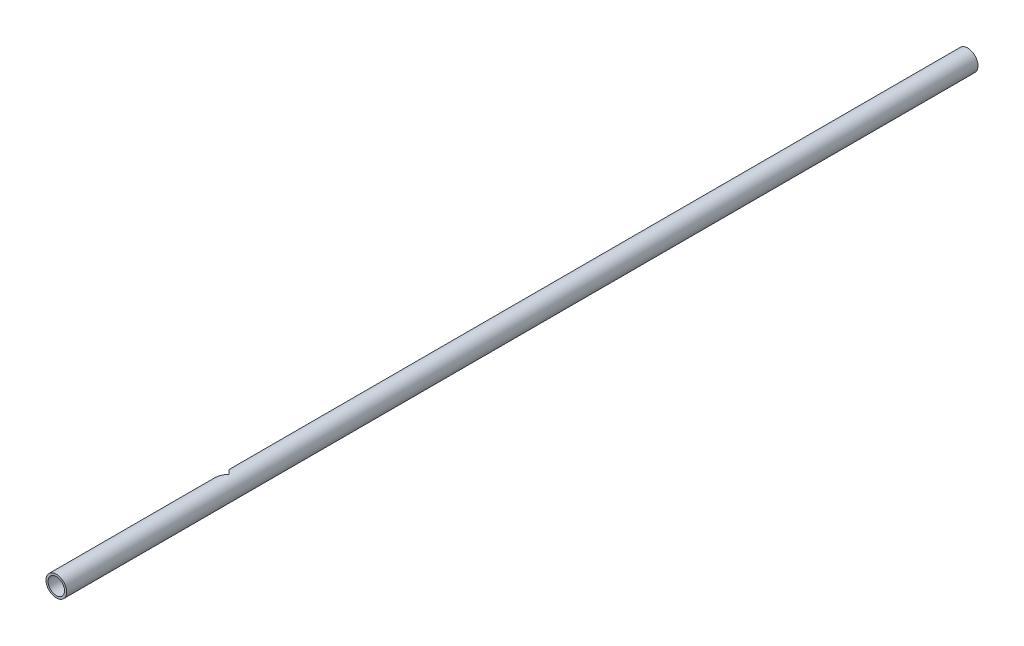
ISO-10303-21;
HEADER;
FILE_DESCRIPTION(('STEP AP214'),'2;1');
FILE_NAME('part.step','',(''),(''),'','','');
FILE_SCHEMA(('AUTOMOTIVE_DESIGN { 1 0 10303 214 1 1 1 1 }'));
ENDSEC;
DATA;
#1=APPLICATION_CONTEXT('core data for automotive mechanical design processes');
#2=APPLICATION_PROTOCOL_DEFINITION('international standard','automotive_design',2000,#1);
#3=PRODUCT_CONTEXT('',#1,'mechanical');
#4=PRODUCT('Part','Part','',(#3));
#5=PRODUCT_RELATED_PRODUCT_CATEGORY('part','',(#4));
#6=PRODUCT_DEFINITION_FORMATION('','',#4);
#7=PRODUCT_DEFINITION_CONTEXT('part definition',#1,'design');
#8=PRODUCT_DEFINITION('design','',#6,#7);
#9=PRODUCT_DEFINITION_SHAPE('','',#8);
#10=(LENGTH_UNIT() NAMED_UNIT(*) SI_UNIT(.MILLI.,.METRE.));
#11=(NAMED_UNIT(*) PLANE_ANGLE_UNIT() SI_UNIT($,.RADIAN.));
#12=(NAMED_UNIT(*) SI_UNIT($,.STERADIAN.) SOLID_ANGLE_UNIT());
#13=UNCERTAINTY_MEASURE_WITH_UNIT(LENGTH_MEASURE(1.E-05),#10,'distance_accuracy_value','');
#14=(GEOMETRIC_REPRESENTATION_CONTEXT(3) GLOBAL_UNCERTAINTY_ASSIGNED_CONTEXT((#13)) GLOBAL_UNIT_ASSIGNED_CONTEXT((#10,
#11,#12)) REPRESENTATION_CONTEXT('',''));
#15=CARTESIAN_POINT('',(0.,0.,0.));
#16=DIRECTION('',(0.,0.,1.));
#17=DIRECTION('',(1.,0.,0.));
#18=AXIS2_PLACEMENT_3D('',#15,#16,#17);
#19=CARTESIAN_POINT('',(0.,0.,1193.8));
#20=DIRECTION('',(-1.,0.,0.));
#21=DIRECTION('',(0.,0.,1.));
#22=AXIS2_PLACEMENT_3D('',#19,#20,#21);
#23=PLANE('',#22);
#24=DIRECTION('',(0.,0.,1.));
#25=VECTOR('',#24,1.);
#26=CARTESIAN_POINT('',(0.,13.3223,0.));
#27=LINE('',#26,#25);
#28=CARTESIAN_POINT('',(0.,13.3223,1203.87089980886));
#29=VERTEX_POINT('',#28);
#30=CARTESIAN_POINT('',(0.,13.3223,1183.72910019114));
#31=VERTEX_POINT('',#30);
#32=EDGE_CURVE('E36',#29,#31,#27,.F.);
#33=ORIENTED_EDGE('',*,*,#32,.F.);
#34=CARTESIAN_POINT('',(0.,0.,1193.8));
#35=DIRECTION('',(-1.,0.,0.));
#36=DIRECTION('',(0.,0.,1.));
#37=AXIS2_PLACEMENT_3D('',#34,#35,#36);
#38=CIRCLE('',#37,16.7005);
#39=CARTESIAN_POINT('',(0.,16.7005,1193.8));
#40=VERTEX_POINT('',#39);
#41=EDGE_CURVE('E27',#40,#29,#38,.F.);
#42=ORIENTED_EDGE('',*,*,#41,.F.);
#43=CARTESIAN_POINT('',(0.,0.,1193.8));
#44=DIRECTION('',(-1.,0.,0.));
#45=DIRECTION('',(0.,0.,1.));
#46=AXIS2_PLACEMENT_3D('',#43,#44,#45);
#47=CIRCLE('',#46,16.7005);
#48=EDGE_CURVE('E69',#31,#40,#47,.F.);
#49=ORIENTED_EDGE('',*,*,#48,.F.);
#50=EDGE_LOOP('',(#33,#42,#49));
#51=FACE_BOUND('',#50,.T.);
#52=ADVANCED_FACE('F16',(#51),#23,.T.);
#53=CARTESIAN_POINT('',(-1071.626,0.,1193.8));
#54=DIRECTION('',(-1.,0.,0.));
#55=DIRECTION('',(0.,0.,1.));
#56=AXIS2_PLACEMENT_3D('',#53,#54,#55);
#57=CYLINDRICAL_SURFACE('',#56,16.7005);
#58=CARTESIAN_POINT('',(0.,-13.3223,1203.87089980886));
#59=CARTESIAN_POINT('',(-0.126832757370223,-13.3223021152488,1203.87089265806));
#60=CARTESIAN_POINT('',(-0.253645928255786,-13.320488246424,1203.87329696551));
#61=CARTESIAN_POINT('',(-0.506975029929705,-13.3132528524142,1203.88285931727));
#62=CARTESIAN_POINT('',(-0.633490994516682,-13.3078317595779,1203.89001679188));
#63=CARTESIAN_POINT('',(-1.01177235978979,-13.2862208320096,1203.91848003125));
#64=CARTESIAN_POINT('',(-1.26275455230498,-13.2646831475207,1203.9467771411));
#65=CARTESIAN_POINT('',(-1.75720966055605,-13.2082187492972,1204.02016341005));
#66=CARTESIAN_POINT('',(-2.00073798079455,-13.1734727327266,1204.06502572066));
#67=CARTESIAN_POINT('',(-2.48245585251262,-13.0912504190976,1204.1696809346));
#68=CARTESIAN_POINT('',(-2.72064271957996,-13.0437678699091,1204.22948116968));
#69=CARTESIAN_POINT('',(-3.27392387011271,-12.9178800784209,1204.38528821748));
#70=CARTESIAN_POINT('',(-3.58638451677515,-12.8344788271495,1204.48661754756));
#71=CARTESIAN_POINT('',(-4.19858092402319,-12.6474563882724,1204.70731166232));
#72=CARTESIAN_POINT('',(-4.49831224233361,-12.5438282113467,1204.82668267801));
#73=CARTESIAN_POINT('',(-5.086793737233,-12.3169935203476,1205.07951253863));
#74=CARTESIAN_POINT('',(-5.37545411982807,-12.1936571450383,1205.21306270373));
#75=CARTESIAN_POINT('',(-5.93970716053347,-11.9289843844594,1205.48942561783));
#76=CARTESIAN_POINT('',(-6.21529981722087,-11.7876479972298,1205.63223836785));
#77=CARTESIAN_POINT('',(-6.84908116635936,-11.4345098379333,1205.97533596053));
#78=CARTESIAN_POINT('',(-7.20194324157739,-11.2154827808072,1206.17805777967));
#79=CARTESIAN_POINT('',(-7.88443264494609,-10.7466658345756,1206.58721252256));
#80=CARTESIAN_POINT('',(-8.21405182841937,-10.4968652453425,1206.79364671569));
#81=CARTESIAN_POINT('',(-8.84888938922373,-9.96751226394812,1207.2040057263));
#82=CARTESIAN_POINT('',(-9.15415176607696,-9.68801574924034,1207.40793447855));
#83=CARTESIAN_POINT('',(-9.73960604058103,-9.09923059392935,1207.80847687177));
#84=CARTESIAN_POINT('',(-10.0198061834844,-8.789951821478,1208.00509290603));
#85=CARTESIAN_POINT('',(-10.5008217978612,-8.20549796542367,1208.34880937689));
#86=CARTESIAN_POINT('',(-10.7064313870766,-7.93552298500092,1208.49806066544));
#87=CARTESIAN_POINT('',(-11.0986927426344,-7.37693177780107,1208.78620335024));
#88=CARTESIAN_POINT('',(-11.2853481547205,-7.08831915342192,1208.92509673742));
#89=CARTESIAN_POINT('',(-11.6378305060951,-6.49338137985306,1209.18988665967));
#90=CARTESIAN_POINT('',(-11.8036781194838,-6.18707426066721,1209.31579607277));
#91=CARTESIAN_POINT('',(-12.1127983684619,-5.55757820685819,1209.55223775474));
#92=CARTESIAN_POINT('',(-12.2560747283453,-5.23439206904332,1209.66277256009));
#93=CARTESIAN_POINT('',(-12.4968990600909,-4.62604756771861,1209.84963289807));
#94=CARTESIAN_POINT('',(-12.5980954510921,-4.34314154006651,1209.92860100313));
#95=CARTESIAN_POINT('',(-12.7819222164608,-3.76792573673958,1210.0725932441));
#96=CARTESIAN_POINT('',(-12.8645561148194,-3.4756177580417,1210.13762002659));
#97=CARTESIAN_POINT('',(-13.0101183902071,-2.88330734627628,1210.25248324504));
#98=CARTESIAN_POINT('',(-13.0730538919298,-2.58330773776101,1210.30232517302));
#99=CARTESIAN_POINT('',(-13.1783080547847,-1.97747126395298,1210.38583125639));
#100=CARTESIAN_POINT('',(-13.2206264690311,-1.67163432880489,1210.41949521806));
#101=CARTESIAN_POINT('',(-13.2840628895291,-1.05529659692288,1210.47000237234));
#102=CARTESIAN_POINT('',(-13.305106616028,-0.744783274956661,1210.48678662906));
#103=CARTESIAN_POINT('',(-13.3253716976057,-0.122588587095684,1210.50294932457));
#104=CARTESIAN_POINT('',(-13.3245930107116,0.189092781044528,1210.50232772989));
#105=CARTESIAN_POINT('',(-13.3012268857457,0.811119200220451,1210.48369295248));
#106=CARTESIAN_POINT('',(-13.2786387347421,1.1214642072386,1210.46567920122));
#107=CARTESIAN_POINT('',(-13.2120405037938,1.73836492071271,1210.41266478341));
#108=CARTESIAN_POINT('',(-13.1680309037406,2.04492071189839,1210.3776644974));
#109=CARTESIAN_POINT('',(-13.0622444622432,2.63563870440854,1210.29376477244));
#110=CARTESIAN_POINT('',(-13.0015519634446,2.92011786361608,1210.24571526347));
#111=CARTESIAN_POINT('',(-12.862468962634,3.4820013710825,1210.13598192115));
#112=CARTESIAN_POINT('',(-12.7840792446403,3.75940603214849,1210.0742986918));
#113=CARTESIAN_POINT('',(-12.6105644708052,4.30575235019669,1209.93835348708));
#114=CARTESIAN_POINT('',(-12.515439059513,4.5746938272855,1209.86409124454));
#115=CARTESIAN_POINT('',(-12.3094581770787,5.10307380647901,1209.70413696172));
#116=CARTESIAN_POINT('',(-12.1985969493381,5.36250878694945,1209.61844073925));
#117=CARTESIAN_POINT('',(-11.9507937074052,5.89548275788421,1209.42810289539));
#118=CARTESIAN_POINT('',(-11.8123667271075,6.16796271902805,1209.32243079186));
#119=CARTESIAN_POINT('',(-11.5191674926393,6.69960193573693,1209.10049218577));
#120=CARTESIAN_POINT('',(-11.3643884837036,6.95875562018983,1208.98422130775));
#121=CARTESIAN_POINT('',(-11.0397596959383,7.46306304137495,1208.74280887398));
#122=CARTESIAN_POINT('',(-10.8699107644079,7.7082175639312,1208.61766781702));
#123=CARTESIAN_POINT('',(-10.5161885616708,8.18421663539891,1208.3601696838));
#124=CARTESIAN_POINT('',(-10.3323134083856,8.41505925633834,1208.22781163982));
#125=CARTESIAN_POINT('',(-9.91233742124878,8.90811773970675,1207.92980043259));
#126=CARTESIAN_POINT('',(-9.67326397324467,9.16704677450606,1207.76288981546));
#127=CARTESIAN_POINT('',(-9.17724517868513,9.66359351955729,1207.42395101712));
#128=CARTESIAN_POINT('',(-8.92029693195157,9.90120775710694,1207.25192200804));
#129=CARTESIAN_POINT('',(-8.38874723309491,10.3554380635933,1206.90547058683));
#130=CARTESIAN_POINT('',(-8.11410752877198,10.5720059066742,1206.73104367683));
#131=CARTESIAN_POINT('',(-7.54810462520832,10.983267684898,1206.3835988137));
#132=CARTESIAN_POINT('',(-7.25674319674894,11.1779639297447,1206.21058071359));
#133=CARTESIAN_POINT('',(-6.68758293982655,11.5264792455538,1205.88708649672));
#134=CARTESIAN_POINT('',(-6.4113867249476,11.6824408235076,1205.73609866802));
#135=CARTESIAN_POINT('',(-5.8452671990992,11.9757320507327,1205.44180745738));
#136=CARTESIAN_POINT('',(-5.55534339416611,12.1130610288536,1205.29850435236));
#137=CARTESIAN_POINT('',(-4.96341276540114,12.3673491406387,1205.02453066273));
#138=CARTESIAN_POINT('',(-4.66149250802848,12.4844298916482,1204.89378691433));
#139=CARTESIAN_POINT('',(-4.04388197667361,12.6979283033207,1204.64876619003));
#140=CARTESIAN_POINT('',(-3.72819382747677,12.7943491389223,1204.53448668484));
#141=CARTESIAN_POINT('',(-3.13853593360074,12.950280486815,1204.34558262642));
#142=CARTESIAN_POINT('',(-2.86659913123421,13.0132792977403,1204.26751938861));
#143=CARTESIAN_POINT('',(-2.31490716444789,13.1226481150561,1204.13007901243));
#144=CARTESIAN_POINT('',(-2.03515759262513,13.1690297034931,1204.07068886264));
#145=CARTESIAN_POINT('',(-1.4650148754167,13.2446697381285,1203.97297239882));
#146=CARTESIAN_POINT('',(-1.17452380728426,13.2736501349849,1203.93498869066));
#147=CARTESIAN_POINT('',(-0.735917760721248,13.3027704615919,1203.89669391445));
#148=CARTESIAN_POINT('',(-0.589023783309832,13.3100856674829,1203.88704208279));
#149=CARTESIAN_POINT('',(-0.294763603570551,13.3198529171612,1203.8741377444));
#150=CARTESIAN_POINT('',(-0.147397308165294,13.3223039347589,1203.87088658801));
#151=CARTESIAN_POINT('',(0.,13.3223,1203.87089980886));
#152=B_SPLINE_CURVE_WITH_KNOTS('',3,(#58,#59,#60,#61,#62,#63,#64,#65,#66,#67,#68,#69,#70,#71,
#72,#73,#74,#75,#76,#77,#78,#79,#80,#81,#82,#83,#84,#85,#86,#87,#88,#89,#90,#91,#92,#93,#94,#95,
#96,#97,#98,#99,#100,#101,#102,#103,#104,#105,#106,#107,#108,#109,#110,#111,#112,#113,#114,#115,
#116,#117,#118,#119,#120,#121,#122,#123,#124,#125,#126,#127,#128,#129,#130,#131,#132,#133,#134,
#135,#136,#137,#138,#139,#140,#141,#142,#143,#144,#145,#146,#147,#148,#149,#150,#151),
.UNSPECIFIED.,.F.,.F.,(4,2,2,2,2,2,2,2,2,2,2,2,2,2,2,2,2,2,2,2,2,2,2,2,2,2,2,2,2,2,2,2,2,2,2,2,
2,2,2,2,2,2,2,2,2,2,4),(0.,0.380424562081323,0.760803536060963,1.5201173224315,2.26939678350503,
3.01904472735258,4.03415167842157,5.04961001793144,6.07205848431148,7.09450706202333,
8.47916981353613,9.86431538609971,11.2468992667789,12.6290266036024,13.7402066602939,
14.8511725804528,15.9610257813142,17.0706956623349,18.0017507149658,18.9326288620541,
19.8631699306325,20.7937221419936,21.7275122352035,22.661304124452,23.5951265395521,
24.5289280357682,25.4124461192197,26.2959250689271,27.1794227851923,28.0632445464739,
29.0324568271665,30.0020710513181,30.971630793874,31.9413208643626,33.1100604493334,
34.278990106055,35.4505380436037,36.6219621457755,37.6750657345503,38.7282072462807,
39.7747852395631,40.8212022831111,41.6897015835267,42.5575943650968,43.4390094904622,
43.8809925028572,44.3230687497526),.UNSPECIFIED.);
#153=CARTESIAN_POINT('',(0.,-13.3223,1203.87089980886));
#154=VERTEX_POINT('',#153);
#155=EDGE_CURVE('E72',#154,#29,#152,.T.);
#156=ORIENTED_EDGE('',*,*,#155,.F.);
#157=CARTESIAN_POINT('',(0.,0.,1193.8));
#158=DIRECTION('',(-1.,0.,0.));
#159=DIRECTION('',(0.,0.,1.));
#160=AXIS2_PLACEMENT_3D('',#157,#158,#159);
#161=CIRCLE('',#160,16.7005);
#162=CARTESIAN_POINT('',(0.,-16.7005,1193.8));
#163=VERTEX_POINT('',#162);
#164=EDGE_CURVE('E10',#154,#163,#161,.F.);
#165=ORIENTED_EDGE('',*,*,#164,.T.);
#166=CARTESIAN_POINT('',(0.,0.,1193.8));
#167=DIRECTION('',(0.707106781186545,0.,0.70710678118655));
#168=DIRECTION('',(0.70710678118655,0.,-0.707106781186545));
#169=AXIS2_PLACEMENT_3D('',#166,#167,#168);
#170=ELLIPSE('',#169,23.618073598412,16.7005);
#171=EDGE_CURVE('E150',#40,#163,#170,.T.);
#172=ORIENTED_EDGE('',*,*,#171,.F.);
#173=ORIENTED_EDGE('',*,*,#41,.T.);
#174=EDGE_LOOP('',(#156,#165,#172,#173));
#175=FACE_BOUND('',#174,.T.);
#176=ADVANCED_FACE('F86',(#175),#57,.F.);
#177=CARTESIAN_POINT('',(-1071.626,0.,1193.8));
#178=DIRECTION('',(-1.,0.,0.));
#179=DIRECTION('',(0.,0.,1.));
#180=AXIS2_PLACEMENT_3D('',#177,#178,#179);
#181=CYLINDRICAL_SURFACE('',#180,16.7005);
#182=CARTESIAN_POINT('',(0.,13.3223,1183.72910019114));
#183=CARTESIAN_POINT('',(-0.126832757370232,13.3223021152488,1183.72910734194));
#184=CARTESIAN_POINT('',(-0.253645928255797,13.3204882464241,1183.72670303449));
#185=CARTESIAN_POINT('',(-0.506975029929717,13.3132528524142,1183.71714068273));
#186=CARTESIAN_POINT('',(-0.633490994516695,13.3078317595779,1183.70998320812));
#187=CARTESIAN_POINT('',(-1.0117723597898,13.2862208320096,1183.68151996875));
#188=CARTESIAN_POINT('',(-1.262754552305,13.2646831475207,1183.6532228589));
#189=CARTESIAN_POINT('',(-1.75720966055609,13.2082187492972,1183.57983658995));
#190=CARTESIAN_POINT('',(-2.0007379807946,13.1734727327266,1183.53497427934));
#191=CARTESIAN_POINT('',(-2.48245585251265,13.0912504190976,1183.4303190654));
#192=CARTESIAN_POINT('',(-2.72064271957998,13.0437678699091,1183.37051883032));
#193=CARTESIAN_POINT('',(-3.27392387011273,12.9178800784209,1183.21471178252));
#194=CARTESIAN_POINT('',(-3.58638451677519,12.8344788271495,1183.11338245244));
#195=CARTESIAN_POINT('',(-4.19858092402324,12.6474563882724,1182.89268833768));
#196=CARTESIAN_POINT('',(-4.49831224233363,12.5438282113467,1182.77331732199));
#197=CARTESIAN_POINT('',(-5.08679373723299,12.3169935203476,1182.52048746137));
#198=CARTESIAN_POINT('',(-5.37545411982807,12.1936571450383,1182.38693729627));
#199=CARTESIAN_POINT('',(-5.93970716053347,11.9289843844594,1182.11057438217));
#200=CARTESIAN_POINT('',(-6.21529981722087,11.7876479972298,1181.96776163215));
#201=CARTESIAN_POINT('',(-6.84908116635933,11.4345098379334,1181.62466403947));
#202=CARTESIAN_POINT('',(-7.20194324157733,11.2154827808072,1181.42194222033));
#203=CARTESIAN_POINT('',(-7.88443264494604,10.7466658345757,1181.01278747744));
#204=CARTESIAN_POINT('',(-8.21405182841935,10.4968652453425,1180.80635328431));
#205=CARTESIAN_POINT('',(-8.84888938922373,9.96751226394812,1180.3959942737));
#206=CARTESIAN_POINT('',(-9.15415176607696,9.68801574924034,1180.19206552145));
#207=CARTESIAN_POINT('',(-9.73960604058103,9.09923059392935,1179.79152312823));
#208=CARTESIAN_POINT('',(-10.0198061834844,8.789951821478,1179.59490709397));
#209=CARTESIAN_POINT('',(-10.5008217978612,8.20549796542367,1179.25119062311));
#210=CARTESIAN_POINT('',(-10.7064313870766,7.93552298500092,1179.10193933456));
#211=CARTESIAN_POINT('',(-11.0986927426344,7.37693177780107,1178.81379664976));
#212=CARTESIAN_POINT('',(-11.2853481547205,7.08831915342192,1178.67490326258));
#213=CARTESIAN_POINT('',(-11.6378305060951,6.49338137985306,1178.41011334033));
#214=CARTESIAN_POINT('',(-11.8036781194838,6.18707426066721,1178.28420392723));
#215=CARTESIAN_POINT('',(-12.1127983684619,5.55757820685819,1178.04776224526));
#216=CARTESIAN_POINT('',(-12.2560747283453,5.23439206904332,1177.93722743991));
#217=CARTESIAN_POINT('',(-12.4968990600909,4.62604756771861,1177.75036710193));
#218=CARTESIAN_POINT('',(-12.5980954510921,4.34314154006651,1177.67139899687));
#219=CARTESIAN_POINT('',(-12.7819222164608,3.76792573673958,1177.5274067559));
#220=CARTESIAN_POINT('',(-12.8645561148194,3.4756177580417,1177.46237997341));
#221=CARTESIAN_POINT('',(-13.0101183902071,2.88330734627628,1177.34751675496));
#222=CARTESIAN_POINT('',(-13.0730538919298,2.58330773776101,1177.29767482698));
#223=CARTESIAN_POINT('',(-13.1783080547847,1.97747126395298,1177.21416874361));
#224=CARTESIAN_POINT('',(-13.2206264690311,1.67163432880489,1177.18050478194));
#225=CARTESIAN_POINT('',(-13.2840628895291,1.05529659692288,1177.12999762766));
#226=CARTESIAN_POINT('',(-13.305106616028,0.744783274956661,1177.11321337094));
#227=CARTESIAN_POINT('',(-13.3253716976057,0.122588587095684,1177.09705067543));
#228=CARTESIAN_POINT('',(-13.3245930107116,-0.189092781044528,1177.09767227011));
#229=CARTESIAN_POINT('',(-13.3012268857457,-0.811119200220444,1177.11630704752));
#230=CARTESIAN_POINT('',(-13.2786387347421,-1.12146420723859,1177.13432079878));
#231=CARTESIAN_POINT('',(-13.2120405037938,-1.7383649207127,1177.18733521659));
#232=CARTESIAN_POINT('',(-13.1680309037406,-2.04492071189838,1177.2223355026));
#233=CARTESIAN_POINT('',(-13.0622444622432,-2.63563870440854,1177.30623522756));
#234=CARTESIAN_POINT('',(-13.0015519634446,-2.92011786361608,1177.35428473653));
#235=CARTESIAN_POINT('',(-12.862468962634,-3.4820013710825,1177.46401807885));
#236=CARTESIAN_POINT('',(-12.7840792446403,-3.75940603214849,1177.5257013082));
#237=CARTESIAN_POINT('',(-12.6105644708052,-4.30575235019669,1177.66164651292));
#238=CARTESIAN_POINT('',(-12.515439059513,-4.5746938272855,1177.73590875546));
#239=CARTESIAN_POINT('',(-12.3094581770787,-5.103073806479,1177.89586303828));
#240=CARTESIAN_POINT('',(-12.1985969493381,-5.36250878694945,1177.98155926075));
#241=CARTESIAN_POINT('',(-11.9507937074052,-5.89548275788421,1178.17189710461));
#242=CARTESIAN_POINT('',(-11.8123667271075,-6.16796271902805,1178.27756920814));
#243=CARTESIAN_POINT('',(-11.5191674926393,-6.69960193573693,1178.49950781423));
#244=CARTESIAN_POINT('',(-11.3643884837036,-6.95875562018983,1178.61577869225));
#245=CARTESIAN_POINT('',(-11.0397596959383,-7.46306304137495,1178.85719112602));
#246=CARTESIAN_POINT('',(-10.8699107644079,-7.7082175639312,1178.98233218298));
#247=CARTESIAN_POINT('',(-10.5161885616709,-8.1842166353989,1179.2398303162));
#248=CARTESIAN_POINT('',(-10.3323134083856,-8.41505925633833,1179.37218836018));
#249=CARTESIAN_POINT('',(-9.9123374212488,-8.90811773970672,1179.67019956741));
#250=CARTESIAN_POINT('',(-9.67326397324469,-9.16704677450604,1179.83711018453));
#251=CARTESIAN_POINT('',(-9.17724517868522,-9.66359351955721,1180.17604898288));
#252=CARTESIAN_POINT('',(-8.92029693195173,-9.9012077571068,1180.34807799196));
#253=CARTESIAN_POINT('',(-8.38874723309503,-10.3554380635932,1180.69452941317));
#254=CARTESIAN_POINT('',(-8.11410752877199,-10.5720059066742,1180.86895632317));
#255=CARTESIAN_POINT('',(-7.54810462520826,-10.9832676848981,1181.2164011863));
#256=CARTESIAN_POINT('',(-7.25674319674894,-11.1779639297447,1181.38941928641));
#257=CARTESIAN_POINT('',(-6.68758293982658,-11.5264792455537,1181.71291350328));
#258=CARTESIAN_POINT('',(-6.41138672494762,-11.6824408235076,1181.86390133198));
#259=CARTESIAN_POINT('',(-5.84526719909922,-11.9757320507327,1182.15819254262));
#260=CARTESIAN_POINT('',(-5.55534339416614,-12.1130610288536,1182.30149564764));
#261=CARTESIAN_POINT('',(-4.96341276540116,-12.3673491406387,1182.57546933727));
#262=CARTESIAN_POINT('',(-4.66149250802849,-12.4844298916482,1182.70621308567));
#263=CARTESIAN_POINT('',(-4.0438819766736,-12.6979283033207,1182.95123380997));
#264=CARTESIAN_POINT('',(-3.72819382747677,-12.7943491389223,1183.06551331516));
#265=CARTESIAN_POINT('',(-3.13853593360075,-12.950280486815,1183.25441737358));
#266=CARTESIAN_POINT('',(-2.86659913123421,-13.0132792977403,1183.33248061139));
#267=CARTESIAN_POINT('',(-2.31490716444789,-13.1226481150561,1183.46992098757));
#268=CARTESIAN_POINT('',(-2.03515759262513,-13.1690297034931,1183.52931113736));
#269=CARTESIAN_POINT('',(-1.46501487541669,-13.2446697381285,1183.62702760118));
#270=CARTESIAN_POINT('',(-1.17452380728424,-13.2736501349849,1183.66501130934));
#271=CARTESIAN_POINT('',(-0.735917760721227,-13.3027704615919,1183.70330608555));
#272=CARTESIAN_POINT('',(-0.589023783309815,-13.3100856674829,1183.71295791721));
#273=CARTESIAN_POINT('',(-0.294763603570543,-13.3198529171612,1183.7258622556));
#274=CARTESIAN_POINT('',(-0.14739730816529,-13.3223039347589,1183.72911341199));
#275=CARTESIAN_POINT('',(0.,-13.3223,1183.72910019114));
#276=B_SPLINE_CURVE_WITH_KNOTS('',3,(#182,#183,#184,#185,#186,#187,#188,#189,#190,#191,#192,
#193,#194,#195,#196,#197,#198,#199,#200,#201,#202,#203,#204,#205,#206,#207,#208,#209,#210,#211,
#212,#213,#214,#215,#216,#217,#218,#219,#220,#221,#222,#223,#224,#225,#226,#227,#228,#229,#230,
#231,#232,#233,#234,#235,#236,#237,#238,#239,#240,#241,#242,#243,#244,#245,#246,#247,#248,#249,
#250,#251,#252,#253,#254,#255,#256,#257,#258,#259,#260,#261,#262,#263,#264,#265,#266,#267,#268,
#269,#270,#271,#272,#273,#274,#275),.UNSPECIFIED.,.F.,.F.,(4,2,2,2,2,2,2,2,2,2,2,2,2,2,2,2,2,2,
2,2,2,2,2,2,2,2,2,2,2,2,2,2,2,2,2,2,2,2,2,2,2,2,2,2,2,2,4),(0.,0.380424562081327,
0.760803536060988,1.52011732243154,2.26939678350509,3.01904472735259,4.03415167842165,
5.04961001793145,6.07205848431149,7.09450706202334,8.47916981353606,9.86431538609972,
11.2468992667789,12.6290266036024,13.7402066602939,14.8511725804528,15.9610257813142,
17.0706956623349,18.0017507149658,18.9326288620542,19.8631699306325,20.7937221419937,
21.7275122352035,22.661304124452,23.5951265395521,24.5289280357682,25.4124461192197,
26.2959250689271,27.1794227851923,28.0632445464739,29.0324568271665,30.0020710513181,
30.9716307938739,31.9413208643626,33.1100604493332,34.2789901060548,35.4505380436038,
36.6219621457755,37.6750657345501,38.7282072462807,39.7747852395631,40.8212022831112,
41.6897015835267,42.5575943650968,43.4390094904622,43.8809925028572,44.3230687497526),.UNSPECIFIED.);
#277=CARTESIAN_POINT('',(0.,-13.3223,1183.72910019114));
#278=VERTEX_POINT('',#277);
#279=EDGE_CURVE('E57',#31,#278,#276,.T.);
#280=ORIENTED_EDGE('',*,*,#279,.F.);
#281=ORIENTED_EDGE('',*,*,#48,.T.);
#282=CARTESIAN_POINT('',(0.,0.,1193.8));
#283=DIRECTION('',(0.707106781186545,0.,-0.70710678118655));
#284=DIRECTION('',(-0.70710678118655,0.,-0.707106781186545));
#285=AXIS2_PLACEMENT_3D('',#282,#283,#284);
#286=ELLIPSE('',#285,23.618073598412,16.7005);
#287=EDGE_CURVE('E51',#163,#40,#286,.T.);
#288=ORIENTED_EDGE('',*,*,#287,.F.);
#289=CARTESIAN_POINT('',(0.,0.,1193.8));
#290=DIRECTION('',(-1.,0.,0.));
#291=DIRECTION('',(0.,0.,1.));
#292=AXIS2_PLACEMENT_3D('',#289,#290,#291);
#293=CIRCLE('',#292,16.7005);
#294=EDGE_CURVE('E65',#163,#278,#293,.F.);
#295=ORIENTED_EDGE('',*,*,#294,.T.);
#296=EDGE_LOOP('',(#280,#281,#288,#295));
#297=FACE_BOUND('',#296,.T.);
#298=ADVANCED_FACE('F66',(#297),#181,.F.);
#299=CARTESIAN_POINT('',(0.,0.,1193.8));
#300=DIRECTION('',(-1.,0.,0.));
#301=DIRECTION('',(0.,0.,1.));
#302=AXIS2_PLACEMENT_3D('',#299,#300,#301);
#303=PLANE('',#302);
#304=DIRECTION('',(0.,0.,1.));
#305=VECTOR('',#304,1.);
#306=CARTESIAN_POINT('',(0.,-13.3223,0.));
#307=LINE('',#306,#305);
#308=EDGE_CURVE('E61',#278,#154,#307,.T.);
#309=ORIENTED_EDGE('',*,*,#308,.F.);
#310=ORIENTED_EDGE('',*,*,#294,.F.);
#311=ORIENTED_EDGE('',*,*,#164,.F.);
#312=EDGE_LOOP('',(#309,#310,#311));
#313=FACE_BOUND('',#312,.T.);
#314=ADVANCED_FACE('F71',(#313),#303,.T.);
#315=CARTESIAN_POINT('',(0.,0.,0.));
#316=DIRECTION('',(0.,0.,1.));
#317=DIRECTION('',(1.,0.,0.));
#318=AXIS2_PLACEMENT_3D('',#315,#316,#317);
#319=CYLINDRICAL_SURFACE('',#318,13.3223);
#320=CARTESIAN_POINT('',(0.,0.,1473.2));
#321=DIRECTION('',(0.,0.,1.));
#322=DIRECTION('',(1.,0.,0.));
#323=AXIS2_PLACEMENT_3D('',#320,#321,#322);
#324=CIRCLE('',#323,13.3223);
#325=CARTESIAN_POINT('',(13.3223,0.,1473.2));
#326=VERTEX_POINT('',#325);
#327=EDGE_CURVE('E62',#326,#326,#324,.T.);
#328=ORIENTED_EDGE('',*,*,#327,.T.);
#329=EDGE_LOOP('',(#328));
#330=FACE_BOUND('',#329,.T.);
#331=ORIENTED_EDGE('',*,*,#279,.T.);
#332=ORIENTED_EDGE('',*,*,#308,.T.);
#333=ORIENTED_EDGE('',*,*,#155,.T.);
#334=ORIENTED_EDGE('',*,*,#32,.T.);
#335=EDGE_LOOP('',(#331,#332,#333,#334));
#336=FACE_BOUND('',#335,.T.);
#337=CARTESIAN_POINT('',(0.,0.,0.));
#338=DIRECTION('',(0.,0.,1.));
#339=DIRECTION('',(1.,0.,0.));
#340=AXIS2_PLACEMENT_3D('',#337,#338,#339);
#341=CIRCLE('',#340,13.3223);
#342=CARTESIAN_POINT('',(13.3223,0.,0.));
#343=VERTEX_POINT('',#342);
#344=EDGE_CURVE('E21',#343,#343,#341,.T.);
#345=ORIENTED_EDGE('',*,*,#344,.F.);
#346=EDGE_LOOP('',(#345));
#347=FACE_BOUND('',#346,.T.);
#348=ADVANCED_FACE('F18',(#330,#336,#347),#319,.F.);
#349=CARTESIAN_POINT('',(0.,0.,0.));
#350=DIRECTION('',(0.,0.,1.));
#351=DIRECTION('',(1.,0.,0.));
#352=AXIS2_PLACEMENT_3D('',#349,#350,#351);
#353=CYLINDRICAL_SURFACE('',#352,16.7005);
#354=CARTESIAN_POINT('',(0.,0.,1473.2));
#355=DIRECTION('',(0.,0.,1.));
#356=DIRECTION('',(1.,0.,0.));
#357=AXIS2_PLACEMENT_3D('',#354,#355,#356);
#358=CIRCLE('',#357,16.7005);
#359=CARTESIAN_POINT('',(16.7005,0.,1473.2));
#360=VERTEX_POINT('',#359);
#361=EDGE_CURVE('E143',#360,#360,#358,.F.);
#362=ORIENTED_EDGE('',*,*,#361,.T.);
#363=EDGE_LOOP('',(#362));
#364=FACE_BOUND('',#363,.T.);
#365=ORIENTED_EDGE('',*,*,#171,.T.);
#366=ORIENTED_EDGE('',*,*,#287,.T.);
#367=EDGE_LOOP('',(#365,#366));
#368=FACE_BOUND('',#367,.T.);
#369=CARTESIAN_POINT('',(0.,0.,0.));
#370=DIRECTION('',(0.,0.,1.));
#371=DIRECTION('',(1.,0.,0.));
#372=AXIS2_PLACEMENT_3D('',#369,#370,#371);
#373=CIRCLE('',#372,16.7005);
#374=CARTESIAN_POINT('',(16.7005,0.,0.));
#375=VERTEX_POINT('',#374);
#376=EDGE_CURVE('E151',#375,#375,#373,.F.);
#377=ORIENTED_EDGE('',*,*,#376,.F.);
#378=EDGE_LOOP('',(#377));
#379=FACE_BOUND('',#378,.T.);
#380=ADVANCED_FACE('F95',(#364,#368,#379),#353,.T.);
#381=CARTESIAN_POINT('',(0.,0.,0.));
#382=DIRECTION('',(0.,0.,1.));
#383=DIRECTION('',(1.,0.,0.));
#384=AXIS2_PLACEMENT_3D('',#381,#382,#383);
#385=PLANE('',#384);
#386=ORIENTED_EDGE('',*,*,#376,.T.);
#387=EDGE_LOOP('',(#386));
#388=FACE_BOUND('',#387,.T.);
#389=ORIENTED_EDGE('',*,*,#344,.T.);
#390=EDGE_LOOP('',(#389));
#391=FACE_BOUND('',#390,.T.);
#392=ADVANCED_FACE('F97',(#388,#391),#385,.F.);
#393=CARTESIAN_POINT('',(0.,0.,1473.2));
#394=DIRECTION('',(0.,0.,1.));
#395=DIRECTION('',(1.,0.,0.));
#396=AXIS2_PLACEMENT_3D('',#393,#394,#395);
#397=PLANE('',#396);
#398=ORIENTED_EDGE('',*,*,#361,.F.);
#399=EDGE_LOOP('',(#398));
#400=FACE_BOUND('',#399,.T.);
#401=ORIENTED_EDGE('',*,*,#327,.F.);
#402=EDGE_LOOP('',(#401));
#403=FACE_BOUND('',#402,.T.);
#404=ADVANCED_FACE('F91',(#400,#403),#397,.T.);
#405=CLOSED_SHELL('',(#52,#176,#298,#314,#348,#380,#392,#404));
#406=MANIFOLD_SOLID_BREP('B1',#405);
#407=ADVANCED_BREP_SHAPE_REPRESENTATION('',(#18,#406),#14);
#408=SHAPE_DEFINITION_REPRESENTATION(#9,#407);
ENDSEC;
END-ISO-10303-21;
